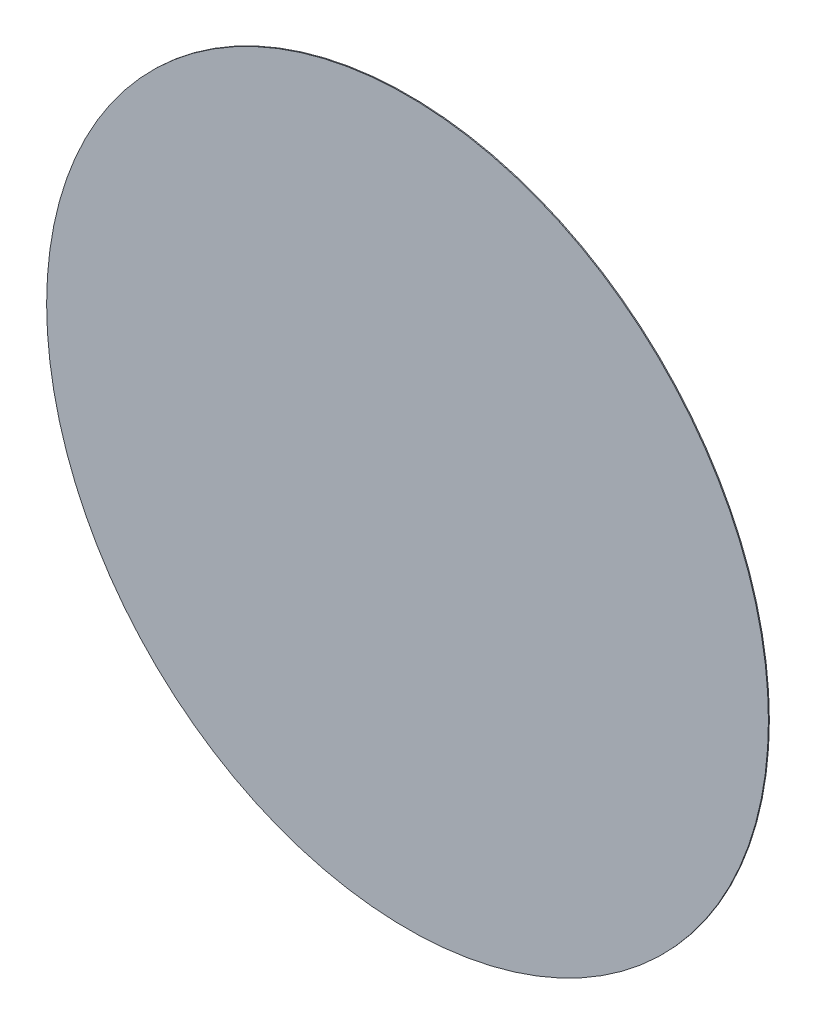
ISO-10303-21;
HEADER;
FILE_DESCRIPTION(('STEP AP214'),'2;1');
FILE_NAME('part.step','',(''),(''),'','','');
FILE_SCHEMA(('AUTOMOTIVE_DESIGN { 1 0 10303 214 1 1 1 1 }'));
ENDSEC;
DATA;
#1=APPLICATION_CONTEXT('core data for automotive mechanical design processes');
#2=APPLICATION_PROTOCOL_DEFINITION('international standard','automotive_design',2000,#1);
#3=PRODUCT_CONTEXT('',#1,'mechanical');
#4=PRODUCT('Part','Part','',(#3));
#5=PRODUCT_RELATED_PRODUCT_CATEGORY('part','',(#4));
#6=PRODUCT_DEFINITION_FORMATION('','',#4);
#7=PRODUCT_DEFINITION_CONTEXT('part definition',#1,'design');
#8=PRODUCT_DEFINITION('design','',#6,#7);
#9=PRODUCT_DEFINITION_SHAPE('','',#8);
#10=(LENGTH_UNIT() NAMED_UNIT(*) SI_UNIT(.MILLI.,.METRE.));
#11=(NAMED_UNIT(*) PLANE_ANGLE_UNIT() SI_UNIT($,.RADIAN.));
#12=(NAMED_UNIT(*) SI_UNIT($,.STERADIAN.) SOLID_ANGLE_UNIT());
#13=UNCERTAINTY_MEASURE_WITH_UNIT(LENGTH_MEASURE(1.E-05),#10,'distance_accuracy_value','');
#14=(GEOMETRIC_REPRESENTATION_CONTEXT(3) GLOBAL_UNCERTAINTY_ASSIGNED_CONTEXT((#13)) GLOBAL_UNIT_ASSIGNED_CONTEXT((#10,
#11,#12)) REPRESENTATION_CONTEXT('',''));
#15=CARTESIAN_POINT('',(0.,0.,0.));
#16=DIRECTION('',(0.,0.,1.));
#17=DIRECTION('',(1.,0.,0.));
#18=AXIS2_PLACEMENT_3D('',#15,#16,#17);
#19=CARTESIAN_POINT('',(0.,0.,0.065));
#20=DIRECTION('',(0.,0.,-1.));
#21=DIRECTION('',(-1.,0.,0.));
#22=AXIS2_PLACEMENT_3D('',#19,#20,#21);
#23=CYLINDRICAL_SURFACE('',#22,25.);
#24=CARTESIAN_POINT('',(0.,0.,0.065));
#25=DIRECTION('',(0.,0.,1.));
#26=DIRECTION('',(1.,0.,0.));
#27=AXIS2_PLACEMENT_3D('',#24,#25,#26);
#28=CIRCLE('',#27,25.);
#29=CARTESIAN_POINT('',(25.,0.,0.065));
#30=VERTEX_POINT('',#29);
#31=EDGE_CURVE('E10',#30,#30,#28,.T.);
#32=ORIENTED_EDGE('',*,*,#31,.F.);
#33=EDGE_LOOP('',(#32));
#34=FACE_BOUND('',#33,.T.);
#35=CARTESIAN_POINT('',(0.,0.,0.));
#36=DIRECTION('',(0.,0.,1.));
#37=DIRECTION('',(1.,0.,0.));
#38=AXIS2_PLACEMENT_3D('',#35,#36,#37);
#39=CIRCLE('',#38,25.);
#40=CARTESIAN_POINT('',(25.,0.,0.));
#41=VERTEX_POINT('',#40);
#42=EDGE_CURVE('E34',#41,#41,#39,.T.);
#43=ORIENTED_EDGE('',*,*,#42,.T.);
#44=EDGE_LOOP('',(#43));
#45=FACE_BOUND('',#44,.T.);
#46=ADVANCED_FACE('F31',(#34,#45),#23,.T.);
#47=CARTESIAN_POINT('',(0.,0.,0.065));
#48=DIRECTION('',(0.,0.,1.));
#49=DIRECTION('',(1.,0.,0.));
#50=AXIS2_PLACEMENT_3D('',#47,#48,#49);
#51=PLANE('',#50);
#52=ORIENTED_EDGE('',*,*,#31,.T.);
#53=EDGE_LOOP('',(#52));
#54=FACE_BOUND('',#53,.T.);
#55=ADVANCED_FACE('F46',(#54),#51,.T.);
#56=CARTESIAN_POINT('',(0.,0.,0.));
#57=DIRECTION('',(0.,0.,1.));
#58=DIRECTION('',(1.,0.,0.));
#59=AXIS2_PLACEMENT_3D('',#56,#57,#58);
#60=PLANE('',#59);
#61=ORIENTED_EDGE('',*,*,#42,.F.);
#62=EDGE_LOOP('',(#61));
#63=FACE_BOUND('',#62,.T.);
#64=ADVANCED_FACE('F44',(#63),#60,.F.);
#65=CLOSED_SHELL('',(#46,#55,#64));
#66=MANIFOLD_SOLID_BREP('B2',#65);
#67=ADVANCED_BREP_SHAPE_REPRESENTATION('',(#18,#66),#14);
#68=SHAPE_DEFINITION_REPRESENTATION(#9,#67);
ENDSEC;
END-ISO-10303-21;
